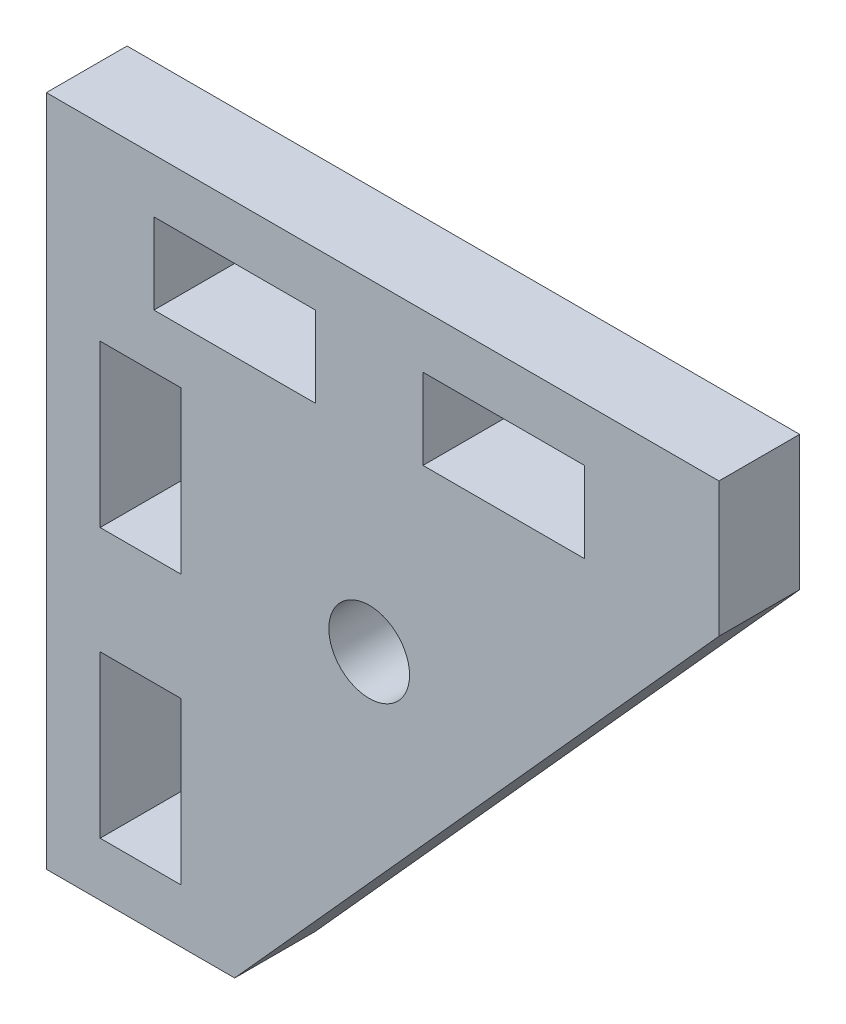
ISO-10303-21;
HEADER;
FILE_DESCRIPTION(('STEP AP214'),'2;1');
FILE_NAME('part.step','',(''),(''),'','','');
FILE_SCHEMA(('AUTOMOTIVE_DESIGN { 1 0 10303 214 1 1 1 1 }'));
ENDSEC;
DATA;
#1=APPLICATION_CONTEXT('core data for automotive mechanical design processes');
#2=APPLICATION_PROTOCOL_DEFINITION('international standard','automotive_design',2000,#1);
#3=PRODUCT_CONTEXT('',#1,'mechanical');
#4=PRODUCT('Part','Part','',(#3));
#5=PRODUCT_RELATED_PRODUCT_CATEGORY('part','',(#4));
#6=PRODUCT_DEFINITION_FORMATION('','',#4);
#7=PRODUCT_DEFINITION_CONTEXT('part definition',#1,'design');
#8=PRODUCT_DEFINITION('design','',#6,#7);
#9=PRODUCT_DEFINITION_SHAPE('','',#8);
#10=(LENGTH_UNIT() NAMED_UNIT(*) SI_UNIT(.MILLI.,.METRE.));
#11=(NAMED_UNIT(*) PLANE_ANGLE_UNIT() SI_UNIT($,.RADIAN.));
#12=(NAMED_UNIT(*) SI_UNIT($,.STERADIAN.) SOLID_ANGLE_UNIT());
#13=UNCERTAINTY_MEASURE_WITH_UNIT(LENGTH_MEASURE(1.E-05),#10,'distance_accuracy_value','');
#14=(GEOMETRIC_REPRESENTATION_CONTEXT(3) GLOBAL_UNCERTAINTY_ASSIGNED_CONTEXT((#13)) GLOBAL_UNIT_ASSIGNED_CONTEXT((#10,
#11,#12)) REPRESENTATION_CONTEXT('',''));
#15=CARTESIAN_POINT('',(0.,0.,0.));
#16=DIRECTION('',(0.,0.,1.));
#17=DIRECTION('',(1.,0.,0.));
#18=AXIS2_PLACEMENT_3D('',#15,#16,#17);
#19=CARTESIAN_POINT('',(0.,0.,3.));
#20=DIRECTION('',(0.,0.,-1.));
#21=DIRECTION('',(-1.,0.,0.));
#22=AXIS2_PLACEMENT_3D('',#19,#20,#21);
#23=PLANE('',#22);
#24=CARTESIAN_POINT('',(12.,-12.,3.));
#25=DIRECTION('',(0.,0.,1.));
#26=DIRECTION('',(1.,0.,0.));
#27=AXIS2_PLACEMENT_3D('',#24,#25,#26);
#28=CIRCLE('',#27,1.5);
#29=CARTESIAN_POINT('',(13.5,-12.,3.));
#30=VERTEX_POINT('',#29);
#31=EDGE_CURVE('E667',#30,#30,#28,.T.);
#32=ORIENTED_EDGE('',*,*,#31,.F.);
#33=EDGE_LOOP('',(#32));
#34=FACE_BOUND('',#33,.T.);
#35=DIRECTION('',(0.,-1.,0.));
#36=VECTOR('',#35,1.);
#37=CARTESIAN_POINT('',(2.,-17.,3.));
#38=LINE('',#37,#36);
#39=CARTESIAN_POINT('',(2.,-17.,3.));
#40=VERTEX_POINT('',#39);
#41=CARTESIAN_POINT('',(2.,-23.,3.));
#42=VERTEX_POINT('',#41);
#43=EDGE_CURVE('E233',#40,#42,#38,.T.);
#44=ORIENTED_EDGE('',*,*,#43,.F.);
#45=DIRECTION('',(-1.,0.,0.));
#46=VECTOR('',#45,1.);
#47=CARTESIAN_POINT('',(2.,-17.,3.));
#48=LINE('',#47,#46);
#49=CARTESIAN_POINT('',(5.,-17.,3.));
#50=VERTEX_POINT('',#49);
#51=EDGE_CURVE('E244',#50,#40,#48,.T.);
#52=ORIENTED_EDGE('',*,*,#51,.F.);
#53=DIRECTION('',(0.,1.,0.));
#54=VECTOR('',#53,1.);
#55=CARTESIAN_POINT('',(5.,-17.,3.));
#56=LINE('',#55,#54);
#57=CARTESIAN_POINT('',(5.,-23.,3.));
#58=VERTEX_POINT('',#57);
#59=EDGE_CURVE('E240',#58,#50,#56,.T.);
#60=ORIENTED_EDGE('',*,*,#59,.F.);
#61=DIRECTION('',(1.,0.,0.));
#62=VECTOR('',#61,1.);
#63=CARTESIAN_POINT('',(2.,-23.,3.));
#64=LINE('',#63,#62);
#65=EDGE_CURVE('E236',#42,#58,#64,.T.);
#66=ORIENTED_EDGE('',*,*,#65,.F.);
#67=EDGE_LOOP('',(#44,#52,#60,#66));
#68=FACE_BOUND('',#67,.T.);
#69=DIRECTION('',(0.,-1.,0.));
#70=VECTOR('',#69,1.);
#71=CARTESIAN_POINT('',(2.,-7.,3.));
#72=LINE('',#71,#70);
#73=CARTESIAN_POINT('',(2.,-7.,3.));
#74=VERTEX_POINT('',#73);
#75=CARTESIAN_POINT('',(2.,-13.,3.));
#76=VERTEX_POINT('',#75);
#77=EDGE_CURVE('E319',#74,#76,#72,.T.);
#78=ORIENTED_EDGE('',*,*,#77,.F.);
#79=DIRECTION('',(-1.,0.,0.));
#80=VECTOR('',#79,1.);
#81=CARTESIAN_POINT('',(2.,-7.,3.));
#82=LINE('',#81,#80);
#83=CARTESIAN_POINT('',(5.,-7.,3.));
#84=VERTEX_POINT('',#83);
#85=EDGE_CURVE('E330',#84,#74,#82,.T.);
#86=ORIENTED_EDGE('',*,*,#85,.F.);
#87=DIRECTION('',(0.,1.,0.));
#88=VECTOR('',#87,1.);
#89=CARTESIAN_POINT('',(5.,-7.,3.));
#90=LINE('',#89,#88);
#91=CARTESIAN_POINT('',(5.,-13.,3.));
#92=VERTEX_POINT('',#91);
#93=EDGE_CURVE('E326',#92,#84,#90,.T.);
#94=ORIENTED_EDGE('',*,*,#93,.F.);
#95=DIRECTION('',(1.,0.,0.));
#96=VECTOR('',#95,1.);
#97=CARTESIAN_POINT('',(2.,-13.,3.));
#98=LINE('',#97,#96);
#99=EDGE_CURVE('E322',#76,#92,#98,.T.);
#100=ORIENTED_EDGE('',*,*,#99,.F.);
#101=EDGE_LOOP('',(#78,#86,#94,#100));
#102=FACE_BOUND('',#101,.T.);
#103=DIRECTION('',(-1.,0.,0.));
#104=VECTOR('',#103,1.);
#105=CARTESIAN_POINT('',(0.,0.,3.));
#106=LINE('',#105,#104);
#107=CARTESIAN_POINT('',(25.,0.,3.));
#108=VERTEX_POINT('',#107);
#109=CARTESIAN_POINT('',(0.,0.,3.));
#110=VERTEX_POINT('',#109);
#111=EDGE_CURVE('E362',#108,#110,#106,.T.);
#112=ORIENTED_EDGE('',*,*,#111,.T.);
#113=DIRECTION('',(0.,-1.,0.));
#114=VECTOR('',#113,1.);
#115=CARTESIAN_POINT('',(0.,0.,3.));
#116=LINE('',#115,#114);
#117=CARTESIAN_POINT('',(0.,-25.,3.));
#118=VERTEX_POINT('',#117);
#119=EDGE_CURVE('E366',#110,#118,#116,.T.);
#120=ORIENTED_EDGE('',*,*,#119,.T.);
#121=DIRECTION('',(1.,0.,0.));
#122=VECTOR('',#121,1.);
#123=CARTESIAN_POINT('',(0.,-25.,3.));
#124=LINE('',#123,#122);
#125=CARTESIAN_POINT('',(7.,-25.,3.));
#126=VERTEX_POINT('',#125);
#127=EDGE_CURVE('E370',#118,#126,#124,.T.);
#128=ORIENTED_EDGE('',*,*,#127,.T.);
#129=DIRECTION('',(0.66896473162245,0.743294146247166,0.));
#130=VECTOR('',#129,1.);
#131=CARTESIAN_POINT('',(25.,-5.,3.));
#132=LINE('',#131,#130);
#133=CARTESIAN_POINT('',(25.,-5.,3.));
#134=VERTEX_POINT('',#133);
#135=EDGE_CURVE('E373',#126,#134,#132,.T.);
#136=ORIENTED_EDGE('',*,*,#135,.T.);
#137=DIRECTION('',(0.,1.,0.));
#138=VECTOR('',#137,1.);
#139=CARTESIAN_POINT('',(25.,0.,3.));
#140=LINE('',#139,#138);
#141=EDGE_CURVE('E376',#134,#108,#140,.T.);
#142=ORIENTED_EDGE('',*,*,#141,.T.);
#143=EDGE_LOOP('',(#112,#120,#128,#136,#142));
#144=FACE_BOUND('',#143,.T.);
#145=DIRECTION('',(0.,-1.,0.));
#146=VECTOR('',#145,1.);
#147=CARTESIAN_POINT('',(4.,-2.,3.));
#148=LINE('',#147,#146);
#149=CARTESIAN_POINT('',(4.,-2.,3.));
#150=VERTEX_POINT('',#149);
#151=CARTESIAN_POINT('',(4.,-5.,3.));
#152=VERTEX_POINT('',#151);
#153=EDGE_CURVE('E276',#150,#152,#148,.T.);
#154=ORIENTED_EDGE('',*,*,#153,.F.);
#155=DIRECTION('',(-1.,0.,0.));
#156=VECTOR('',#155,1.);
#157=CARTESIAN_POINT('',(4.,-2.,3.));
#158=LINE('',#157,#156);
#159=CARTESIAN_POINT('',(10.,-2.,3.));
#160=VERTEX_POINT('',#159);
#161=EDGE_CURVE('E287',#160,#150,#158,.T.);
#162=ORIENTED_EDGE('',*,*,#161,.F.);
#163=DIRECTION('',(0.,1.,0.));
#164=VECTOR('',#163,1.);
#165=CARTESIAN_POINT('',(10.,-2.,3.));
#166=LINE('',#165,#164);
#167=CARTESIAN_POINT('',(10.,-5.,3.));
#168=VERTEX_POINT('',#167);
#169=EDGE_CURVE('E283',#168,#160,#166,.T.);
#170=ORIENTED_EDGE('',*,*,#169,.F.);
#171=DIRECTION('',(1.,0.,0.));
#172=VECTOR('',#171,1.);
#173=CARTESIAN_POINT('',(4.,-5.,3.));
#174=LINE('',#173,#172);
#175=EDGE_CURVE('E279',#152,#168,#174,.T.);
#176=ORIENTED_EDGE('',*,*,#175,.F.);
#177=EDGE_LOOP('',(#154,#162,#170,#176));
#178=FACE_BOUND('',#177,.T.);
#179=DIRECTION('',(-1.,0.,0.));
#180=VECTOR('',#179,1.);
#181=CARTESIAN_POINT('',(14.,-2.,3.));
#182=LINE('',#181,#180);
#183=CARTESIAN_POINT('',(20.,-2.,3.));
#184=VERTEX_POINT('',#183);
#185=CARTESIAN_POINT('',(14.,-2.,3.));
#186=VERTEX_POINT('',#185);
#187=EDGE_CURVE('E184',#184,#186,#182,.T.);
#188=ORIENTED_EDGE('',*,*,#187,.F.);
#189=DIRECTION('',(0.,1.,0.));
#190=VECTOR('',#189,1.);
#191=CARTESIAN_POINT('',(20.,-2.,3.));
#192=LINE('',#191,#190);
#193=CARTESIAN_POINT('',(20.,-5.,3.));
#194=VERTEX_POINT('',#193);
#195=EDGE_CURVE('E210',#194,#184,#192,.T.);
#196=ORIENTED_EDGE('',*,*,#195,.F.);
#197=DIRECTION('',(1.,0.,0.));
#198=VECTOR('',#197,1.);
#199=CARTESIAN_POINT('',(14.,-5.,3.));
#200=LINE('',#199,#198);
#201=CARTESIAN_POINT('',(14.,-5.,3.));
#202=VERTEX_POINT('',#201);
#203=EDGE_CURVE('E206',#202,#194,#200,.T.);
#204=ORIENTED_EDGE('',*,*,#203,.F.);
#205=DIRECTION('',(0.,-1.,0.));
#206=VECTOR('',#205,1.);
#207=CARTESIAN_POINT('',(14.,-2.,3.));
#208=LINE('',#207,#206);
#209=EDGE_CURVE('E193',#186,#202,#208,.T.);
#210=ORIENTED_EDGE('',*,*,#209,.F.);
#211=EDGE_LOOP('',(#188,#196,#204,#210));
#212=FACE_BOUND('',#211,.T.);
#213=ADVANCED_FACE('F39',(#34,#68,#102,#144,#178,#212),#23,.F.);
#214=CARTESIAN_POINT('',(0.,0.,0.));
#215=DIRECTION('',(0.,0.,-1.));
#216=DIRECTION('',(-1.,0.,0.));
#217=AXIS2_PLACEMENT_3D('',#214,#215,#216);
#218=PLANE('',#217);
#219=CARTESIAN_POINT('',(12.,-12.,0.));
#220=DIRECTION('',(0.,0.,-1.));
#221=DIRECTION('',(-1.,0.,0.));
#222=AXIS2_PLACEMENT_3D('',#219,#220,#221);
#223=CIRCLE('',#222,1.5);
#224=CARTESIAN_POINT('',(10.5,-12.,0.));
#225=VERTEX_POINT('',#224);
#226=EDGE_CURVE('E43',#225,#225,#223,.T.);
#227=ORIENTED_EDGE('',*,*,#226,.F.);
#228=EDGE_LOOP('',(#227));
#229=FACE_BOUND('',#228,.T.);
#230=DIRECTION('',(-1.,0.,0.));
#231=VECTOR('',#230,1.);
#232=CARTESIAN_POINT('',(0.,0.,0.));
#233=LINE('',#232,#231);
#234=CARTESIAN_POINT('',(25.,0.,0.));
#235=VERTEX_POINT('',#234);
#236=CARTESIAN_POINT('',(0.,0.,0.));
#237=VERTEX_POINT('',#236);
#238=EDGE_CURVE('E361',#235,#237,#233,.T.);
#239=ORIENTED_EDGE('',*,*,#238,.F.);
#240=DIRECTION('',(0.,1.,0.));
#241=VECTOR('',#240,1.);
#242=CARTESIAN_POINT('',(25.,0.,0.));
#243=LINE('',#242,#241);
#244=CARTESIAN_POINT('',(25.,-5.,0.));
#245=VERTEX_POINT('',#244);
#246=EDGE_CURVE('E367',#245,#235,#243,.T.);
#247=ORIENTED_EDGE('',*,*,#246,.F.);
#248=DIRECTION('',(0.66896473162245,0.743294146247166,0.));
#249=VECTOR('',#248,1.);
#250=CARTESIAN_POINT('',(25.,-5.,0.));
#251=LINE('',#250,#249);
#252=CARTESIAN_POINT('',(7.,-25.,0.));
#253=VERTEX_POINT('',#252);
#254=EDGE_CURVE('E389',#253,#245,#251,.T.);
#255=ORIENTED_EDGE('',*,*,#254,.F.);
#256=DIRECTION('',(1.,0.,0.));
#257=VECTOR('',#256,1.);
#258=CARTESIAN_POINT('',(0.,-25.,0.));
#259=LINE('',#258,#257);
#260=CARTESIAN_POINT('',(0.,-25.,0.));
#261=VERTEX_POINT('',#260);
#262=EDGE_CURVE('E386',#261,#253,#259,.T.);
#263=ORIENTED_EDGE('',*,*,#262,.F.);
#264=DIRECTION('',(0.,-1.,0.));
#265=VECTOR('',#264,1.);
#266=CARTESIAN_POINT('',(0.,-5.,0.));
#267=LINE('',#266,#265);
#268=EDGE_CURVE('E383',#237,#261,#267,.T.);
#269=ORIENTED_EDGE('',*,*,#268,.F.);
#270=EDGE_LOOP('',(#239,#247,#255,#263,#269));
#271=FACE_BOUND('',#270,.T.);
#272=DIRECTION('',(-1.,0.,0.));
#273=VECTOR('',#272,1.);
#274=CARTESIAN_POINT('',(2.,-7.,0.));
#275=LINE('',#274,#273);
#276=CARTESIAN_POINT('',(5.,-7.,0.));
#277=VERTEX_POINT('',#276);
#278=CARTESIAN_POINT('',(2.,-7.,0.));
#279=VERTEX_POINT('',#278);
#280=EDGE_CURVE('E323',#277,#279,#275,.T.);
#281=ORIENTED_EDGE('',*,*,#280,.T.);
#282=DIRECTION('',(0.,-1.,0.));
#283=VECTOR('',#282,1.);
#284=CARTESIAN_POINT('',(2.,-7.,0.));
#285=LINE('',#284,#283);
#286=CARTESIAN_POINT('',(2.,-13.,0.));
#287=VERTEX_POINT('',#286);
#288=EDGE_CURVE('E318',#279,#287,#285,.T.);
#289=ORIENTED_EDGE('',*,*,#288,.T.);
#290=DIRECTION('',(1.,0.,0.));
#291=VECTOR('',#290,1.);
#292=CARTESIAN_POINT('',(2.,-13.,0.));
#293=LINE('',#292,#291);
#294=CARTESIAN_POINT('',(5.,-13.,0.));
#295=VERTEX_POINT('',#294);
#296=EDGE_CURVE('E337',#287,#295,#293,.T.);
#297=ORIENTED_EDGE('',*,*,#296,.T.);
#298=DIRECTION('',(0.,1.,0.));
#299=VECTOR('',#298,1.);
#300=CARTESIAN_POINT('',(5.,-7.,0.));
#301=LINE('',#300,#299);
#302=EDGE_CURVE('E341',#295,#277,#301,.T.);
#303=ORIENTED_EDGE('',*,*,#302,.T.);
#304=EDGE_LOOP('',(#281,#289,#297,#303));
#305=FACE_BOUND('',#304,.T.);
#306=DIRECTION('',(-1.,0.,0.));
#307=VECTOR('',#306,1.);
#308=CARTESIAN_POINT('',(4.,-2.,0.));
#309=LINE('',#308,#307);
#310=CARTESIAN_POINT('',(10.,-2.,0.));
#311=VERTEX_POINT('',#310);
#312=CARTESIAN_POINT('',(4.,-2.,0.));
#313=VERTEX_POINT('',#312);
#314=EDGE_CURVE('E280',#311,#313,#309,.T.);
#315=ORIENTED_EDGE('',*,*,#314,.T.);
#316=DIRECTION('',(0.,-1.,0.));
#317=VECTOR('',#316,1.);
#318=CARTESIAN_POINT('',(4.,-2.,0.));
#319=LINE('',#318,#317);
#320=CARTESIAN_POINT('',(4.,-5.,0.));
#321=VERTEX_POINT('',#320);
#322=EDGE_CURVE('E275',#313,#321,#319,.T.);
#323=ORIENTED_EDGE('',*,*,#322,.T.);
#324=DIRECTION('',(1.,0.,0.));
#325=VECTOR('',#324,1.);
#326=CARTESIAN_POINT('',(4.,-5.,0.));
#327=LINE('',#326,#325);
#328=CARTESIAN_POINT('',(10.,-5.,0.));
#329=VERTEX_POINT('',#328);
#330=EDGE_CURVE('E294',#321,#329,#327,.T.);
#331=ORIENTED_EDGE('',*,*,#330,.T.);
#332=DIRECTION('',(0.,1.,0.));
#333=VECTOR('',#332,1.);
#334=CARTESIAN_POINT('',(10.,-2.,0.));
#335=LINE('',#334,#333);
#336=EDGE_CURVE('E298',#329,#311,#335,.T.);
#337=ORIENTED_EDGE('',*,*,#336,.T.);
#338=EDGE_LOOP('',(#315,#323,#331,#337));
#339=FACE_BOUND('',#338,.T.);
#340=DIRECTION('',(-1.,0.,0.));
#341=VECTOR('',#340,1.);
#342=CARTESIAN_POINT('',(2.,-17.,0.));
#343=LINE('',#342,#341);
#344=CARTESIAN_POINT('',(5.,-17.,0.));
#345=VERTEX_POINT('',#344);
#346=CARTESIAN_POINT('',(2.,-17.,0.));
#347=VERTEX_POINT('',#346);
#348=EDGE_CURVE('E237',#345,#347,#343,.T.);
#349=ORIENTED_EDGE('',*,*,#348,.T.);
#350=DIRECTION('',(0.,-1.,0.));
#351=VECTOR('',#350,1.);
#352=CARTESIAN_POINT('',(2.,-17.,0.));
#353=LINE('',#352,#351);
#354=CARTESIAN_POINT('',(2.,-23.,0.));
#355=VERTEX_POINT('',#354);
#356=EDGE_CURVE('E202',#347,#355,#353,.T.);
#357=ORIENTED_EDGE('',*,*,#356,.T.);
#358=DIRECTION('',(1.,0.,0.));
#359=VECTOR('',#358,1.);
#360=CARTESIAN_POINT('',(2.,-23.,0.));
#361=LINE('',#360,#359);
#362=CARTESIAN_POINT('',(5.,-23.,0.));
#363=VERTEX_POINT('',#362);
#364=EDGE_CURVE('E251',#355,#363,#361,.T.);
#365=ORIENTED_EDGE('',*,*,#364,.T.);
#366=DIRECTION('',(0.,1.,0.));
#367=VECTOR('',#366,1.);
#368=CARTESIAN_POINT('',(5.,-17.,0.));
#369=LINE('',#368,#367);
#370=EDGE_CURVE('E255',#363,#345,#369,.T.);
#371=ORIENTED_EDGE('',*,*,#370,.T.);
#372=EDGE_LOOP('',(#349,#357,#365,#371));
#373=FACE_BOUND('',#372,.T.);
#374=DIRECTION('',(0.,1.,0.));
#375=VECTOR('',#374,1.);
#376=CARTESIAN_POINT('',(20.,-2.,0.));
#377=LINE('',#376,#375);
#378=CARTESIAN_POINT('',(20.,-5.,0.));
#379=VERTEX_POINT('',#378);
#380=CARTESIAN_POINT('',(20.,-2.,0.));
#381=VERTEX_POINT('',#380);
#382=EDGE_CURVE('E194',#379,#381,#377,.T.);
#383=ORIENTED_EDGE('',*,*,#382,.T.);
#384=DIRECTION('',(-1.,0.,0.));
#385=VECTOR('',#384,1.);
#386=CARTESIAN_POINT('',(14.,-2.,0.));
#387=LINE('',#386,#385);
#388=CARTESIAN_POINT('',(14.,-2.,0.));
#389=VERTEX_POINT('',#388);
#390=EDGE_CURVE('E64',#381,#389,#387,.T.);
#391=ORIENTED_EDGE('',*,*,#390,.T.);
#392=DIRECTION('',(0.,-1.,0.));
#393=VECTOR('',#392,1.);
#394=CARTESIAN_POINT('',(14.,-2.,0.));
#395=LINE('',#394,#393);
#396=CARTESIAN_POINT('',(14.,-5.,0.));
#397=VERTEX_POINT('',#396);
#398=EDGE_CURVE('E200',#389,#397,#395,.T.);
#399=ORIENTED_EDGE('',*,*,#398,.T.);
#400=DIRECTION('',(1.,0.,0.));
#401=VECTOR('',#400,1.);
#402=CARTESIAN_POINT('',(14.,-5.,0.));
#403=LINE('',#402,#401);
#404=EDGE_CURVE('E220',#397,#379,#403,.T.);
#405=ORIENTED_EDGE('',*,*,#404,.T.);
#406=EDGE_LOOP('',(#383,#391,#399,#405));
#407=FACE_BOUND('',#406,.T.);
#408=ADVANCED_FACE('F417',(#229,#271,#305,#339,#373,#407),#218,.T.);
#409=CARTESIAN_POINT('',(0.,0.,3.));
#410=DIRECTION('',(0.,-1.,0.));
#411=DIRECTION('',(0.,0.,-1.));
#412=AXIS2_PLACEMENT_3D('',#409,#410,#411);
#413=PLANE('',#412);
#414=ORIENTED_EDGE('',*,*,#238,.T.);
#415=DIRECTION('',(0.,0.,-1.));
#416=VECTOR('',#415,1.);
#417=CARTESIAN_POINT('',(0.,0.,3.));
#418=LINE('',#417,#416);
#419=EDGE_CURVE('E11',#110,#237,#418,.T.);
#420=ORIENTED_EDGE('',*,*,#419,.F.);
#421=ORIENTED_EDGE('',*,*,#111,.F.);
#422=DIRECTION('',(0.,0.,-1.));
#423=VECTOR('',#422,1.);
#424=CARTESIAN_POINT('',(25.,0.,3.));
#425=LINE('',#424,#423);
#426=EDGE_CURVE('E379',#108,#235,#425,.T.);
#427=ORIENTED_EDGE('',*,*,#426,.T.);
#428=EDGE_LOOP('',(#414,#420,#421,#427));
#429=FACE_BOUND('',#428,.T.);
#430=ADVANCED_FACE('F41',(#429),#413,.F.);
#431=CARTESIAN_POINT('',(0.,-5.,3.));
#432=DIRECTION('',(1.,0.,0.));
#433=DIRECTION('',(0.,1.,0.));
#434=AXIS2_PLACEMENT_3D('',#431,#432,#433);
#435=PLANE('',#434);
#436=ORIENTED_EDGE('',*,*,#268,.T.);
#437=DIRECTION('',(0.,0.,-1.));
#438=VECTOR('',#437,1.);
#439=CARTESIAN_POINT('',(0.,-25.,3.));
#440=LINE('',#439,#438);
#441=EDGE_CURVE('E49',#118,#261,#440,.T.);
#442=ORIENTED_EDGE('',*,*,#441,.F.);
#443=ORIENTED_EDGE('',*,*,#119,.F.);
#444=ORIENTED_EDGE('',*,*,#419,.T.);
#445=EDGE_LOOP('',(#436,#442,#443,#444));
#446=FACE_BOUND('',#445,.T.);
#447=ADVANCED_FACE('F432',(#446),#435,.F.);
#448=CARTESIAN_POINT('',(0.,-25.,3.));
#449=DIRECTION('',(0.,1.,0.));
#450=DIRECTION('',(0.,0.,1.));
#451=AXIS2_PLACEMENT_3D('',#448,#449,#450);
#452=PLANE('',#451);
#453=ORIENTED_EDGE('',*,*,#262,.T.);
#454=DIRECTION('',(0.,0.,-1.));
#455=VECTOR('',#454,1.);
#456=CARTESIAN_POINT('',(7.,-25.,3.));
#457=LINE('',#456,#455);
#458=EDGE_CURVE('E401',#126,#253,#457,.T.);
#459=ORIENTED_EDGE('',*,*,#458,.F.);
#460=ORIENTED_EDGE('',*,*,#127,.F.);
#461=ORIENTED_EDGE('',*,*,#441,.T.);
#462=EDGE_LOOP('',(#453,#459,#460,#461));
#463=FACE_BOUND('',#462,.T.);
#464=ADVANCED_FACE('F411',(#463),#452,.F.);
#465=CARTESIAN_POINT('',(25.,-5.,3.));
#466=DIRECTION('',(-0.743294146247166,0.66896473162245,0.));
#467=DIRECTION('',(-0.66896473162245,-0.743294146247166,0.));
#468=AXIS2_PLACEMENT_3D('',#465,#466,#467);
#469=PLANE('',#468);
#470=ORIENTED_EDGE('',*,*,#254,.T.);
#471=DIRECTION('',(0.,0.,-1.));
#472=VECTOR('',#471,1.);
#473=CARTESIAN_POINT('',(25.,-5.,3.));
#474=LINE('',#473,#472);
#475=EDGE_CURVE('E397',#134,#245,#474,.T.);
#476=ORIENTED_EDGE('',*,*,#475,.F.);
#477=ORIENTED_EDGE('',*,*,#135,.F.);
#478=ORIENTED_EDGE('',*,*,#458,.T.);
#479=EDGE_LOOP('',(#470,#476,#477,#478));
#480=FACE_BOUND('',#479,.T.);
#481=ADVANCED_FACE('F422',(#480),#469,.F.);
#482=CARTESIAN_POINT('',(25.,0.,3.));
#483=DIRECTION('',(-1.,0.,0.));
#484=DIRECTION('',(0.,0.,1.));
#485=AXIS2_PLACEMENT_3D('',#482,#483,#484);
#486=PLANE('',#485);
#487=ORIENTED_EDGE('',*,*,#246,.T.);
#488=ORIENTED_EDGE('',*,*,#426,.F.);
#489=ORIENTED_EDGE('',*,*,#141,.F.);
#490=ORIENTED_EDGE('',*,*,#475,.T.);
#491=EDGE_LOOP('',(#487,#488,#489,#490));
#492=FACE_BOUND('',#491,.T.);
#493=ADVANCED_FACE('F426',(#492),#486,.F.);
#494=CARTESIAN_POINT('',(2.,-7.,3.));
#495=DIRECTION('',(1.,0.,0.));
#496=DIRECTION('',(0.,1.,0.));
#497=AXIS2_PLACEMENT_3D('',#494,#495,#496);
#498=PLANE('',#497);
#499=ORIENTED_EDGE('',*,*,#288,.F.);
#500=DIRECTION('',(0.,0.,-1.));
#501=VECTOR('',#500,1.);
#502=CARTESIAN_POINT('',(2.,-7.,3.));
#503=LINE('',#502,#501);
#504=EDGE_CURVE('E333',#74,#279,#503,.T.);
#505=ORIENTED_EDGE('',*,*,#504,.F.);
#506=ORIENTED_EDGE('',*,*,#77,.T.);
#507=DIRECTION('',(0.,0.,-1.));
#508=VECTOR('',#507,1.);
#509=CARTESIAN_POINT('',(2.,-13.,3.));
#510=LINE('',#509,#508);
#511=EDGE_CURVE('E357',#76,#287,#510,.T.);
#512=ORIENTED_EDGE('',*,*,#511,.T.);
#513=EDGE_LOOP('',(#499,#505,#506,#512));
#514=FACE_BOUND('',#513,.T.);
#515=ADVANCED_FACE('F449',(#514),#498,.T.);
#516=CARTESIAN_POINT('',(2.,-13.,3.));
#517=DIRECTION('',(0.,1.,0.));
#518=DIRECTION('',(0.,0.,1.));
#519=AXIS2_PLACEMENT_3D('',#516,#517,#518);
#520=PLANE('',#519);
#521=ORIENTED_EDGE('',*,*,#296,.F.);
#522=ORIENTED_EDGE('',*,*,#511,.F.);
#523=ORIENTED_EDGE('',*,*,#99,.T.);
#524=DIRECTION('',(0.,0.,-1.));
#525=VECTOR('',#524,1.);
#526=CARTESIAN_POINT('',(5.,-13.,3.));
#527=LINE('',#526,#525);
#528=EDGE_CURVE('E354',#92,#295,#527,.T.);
#529=ORIENTED_EDGE('',*,*,#528,.T.);
#530=EDGE_LOOP('',(#521,#522,#523,#529));
#531=FACE_BOUND('',#530,.T.);
#532=ADVANCED_FACE('F475',(#531),#520,.T.);
#533=CARTESIAN_POINT('',(5.,-7.,3.));
#534=DIRECTION('',(-1.,0.,0.));
#535=DIRECTION('',(0.,0.,1.));
#536=AXIS2_PLACEMENT_3D('',#533,#534,#535);
#537=PLANE('',#536);
#538=ORIENTED_EDGE('',*,*,#302,.F.);
#539=ORIENTED_EDGE('',*,*,#528,.F.);
#540=ORIENTED_EDGE('',*,*,#93,.T.);
#541=DIRECTION('',(0.,0.,-1.));
#542=VECTOR('',#541,1.);
#543=CARTESIAN_POINT('',(5.,-7.,3.));
#544=LINE('',#543,#542);
#545=EDGE_CURVE('E351',#84,#277,#544,.T.);
#546=ORIENTED_EDGE('',*,*,#545,.T.);
#547=EDGE_LOOP('',(#538,#539,#540,#546));
#548=FACE_BOUND('',#547,.T.);
#549=ADVANCED_FACE('F482',(#548),#537,.T.);
#550=CARTESIAN_POINT('',(2.,-7.,3.));
#551=DIRECTION('',(0.,-1.,0.));
#552=DIRECTION('',(0.,0.,-1.));
#553=AXIS2_PLACEMENT_3D('',#550,#551,#552);
#554=PLANE('',#553);
#555=ORIENTED_EDGE('',*,*,#280,.F.);
#556=ORIENTED_EDGE('',*,*,#545,.F.);
#557=ORIENTED_EDGE('',*,*,#85,.T.);
#558=ORIENTED_EDGE('',*,*,#504,.T.);
#559=EDGE_LOOP('',(#555,#556,#557,#558));
#560=FACE_BOUND('',#559,.T.);
#561=ADVANCED_FACE('F489',(#560),#554,.T.);
#562=CARTESIAN_POINT('',(4.,-2.,3.));
#563=DIRECTION('',(1.,0.,0.));
#564=DIRECTION('',(0.,1.,0.));
#565=AXIS2_PLACEMENT_3D('',#562,#563,#564);
#566=PLANE('',#565);
#567=ORIENTED_EDGE('',*,*,#322,.F.);
#568=DIRECTION('',(0.,0.,-1.));
#569=VECTOR('',#568,1.);
#570=CARTESIAN_POINT('',(4.,-2.,3.));
#571=LINE('',#570,#569);
#572=EDGE_CURVE('E290',#150,#313,#571,.T.);
#573=ORIENTED_EDGE('',*,*,#572,.F.);
#574=ORIENTED_EDGE('',*,*,#153,.T.);
#575=DIRECTION('',(0.,0.,-1.));
#576=VECTOR('',#575,1.);
#577=CARTESIAN_POINT('',(4.,-5.,3.));
#578=LINE('',#577,#576);
#579=EDGE_CURVE('E314',#152,#321,#578,.T.);
#580=ORIENTED_EDGE('',*,*,#579,.T.);
#581=EDGE_LOOP('',(#567,#573,#574,#580));
#582=FACE_BOUND('',#581,.T.);
#583=ADVANCED_FACE('F497',(#582),#566,.T.);
#584=CARTESIAN_POINT('',(4.,-5.,3.));
#585=DIRECTION('',(0.,1.,0.));
#586=DIRECTION('',(0.,0.,1.));
#587=AXIS2_PLACEMENT_3D('',#584,#585,#586);
#588=PLANE('',#587);
#589=ORIENTED_EDGE('',*,*,#330,.F.);
#590=ORIENTED_EDGE('',*,*,#579,.F.);
#591=ORIENTED_EDGE('',*,*,#175,.T.);
#592=DIRECTION('',(0.,0.,-1.));
#593=VECTOR('',#592,1.);
#594=CARTESIAN_POINT('',(10.,-5.,3.));
#595=LINE('',#594,#593);
#596=EDGE_CURVE('E311',#168,#329,#595,.T.);
#597=ORIENTED_EDGE('',*,*,#596,.T.);
#598=EDGE_LOOP('',(#589,#590,#591,#597));
#599=FACE_BOUND('',#598,.T.);
#600=ADVANCED_FACE('F505',(#599),#588,.T.);
#601=CARTESIAN_POINT('',(10.,-2.,3.));
#602=DIRECTION('',(-1.,0.,0.));
#603=DIRECTION('',(0.,0.,1.));
#604=AXIS2_PLACEMENT_3D('',#601,#602,#603);
#605=PLANE('',#604);
#606=ORIENTED_EDGE('',*,*,#336,.F.);
#607=ORIENTED_EDGE('',*,*,#596,.F.);
#608=ORIENTED_EDGE('',*,*,#169,.T.);
#609=DIRECTION('',(0.,0.,-1.));
#610=VECTOR('',#609,1.);
#611=CARTESIAN_POINT('',(10.,-2.,3.));
#612=LINE('',#611,#610);
#613=EDGE_CURVE('E308',#160,#311,#612,.T.);
#614=ORIENTED_EDGE('',*,*,#613,.T.);
#615=EDGE_LOOP('',(#606,#607,#608,#614));
#616=FACE_BOUND('',#615,.T.);
#617=ADVANCED_FACE('F513',(#616),#605,.T.);
#618=CARTESIAN_POINT('',(4.,-2.,3.));
#619=DIRECTION('',(0.,-1.,0.));
#620=DIRECTION('',(0.,0.,-1.));
#621=AXIS2_PLACEMENT_3D('',#618,#619,#620);
#622=PLANE('',#621);
#623=ORIENTED_EDGE('',*,*,#314,.F.);
#624=ORIENTED_EDGE('',*,*,#613,.F.);
#625=ORIENTED_EDGE('',*,*,#161,.T.);
#626=ORIENTED_EDGE('',*,*,#572,.T.);
#627=EDGE_LOOP('',(#623,#624,#625,#626));
#628=FACE_BOUND('',#627,.T.);
#629=ADVANCED_FACE('F521',(#628),#622,.T.);
#630=CARTESIAN_POINT('',(2.,-17.,3.));
#631=DIRECTION('',(1.,0.,0.));
#632=DIRECTION('',(0.,1.,0.));
#633=AXIS2_PLACEMENT_3D('',#630,#631,#632);
#634=PLANE('',#633);
#635=ORIENTED_EDGE('',*,*,#356,.F.);
#636=DIRECTION('',(0.,0.,-1.));
#637=VECTOR('',#636,1.);
#638=CARTESIAN_POINT('',(2.,-17.,3.));
#639=LINE('',#638,#637);
#640=EDGE_CURVE('E247',#40,#347,#639,.T.);
#641=ORIENTED_EDGE('',*,*,#640,.F.);
#642=ORIENTED_EDGE('',*,*,#43,.T.);
#643=DIRECTION('',(0.,0.,-1.));
#644=VECTOR('',#643,1.);
#645=CARTESIAN_POINT('',(2.,-23.,3.));
#646=LINE('',#645,#644);
#647=EDGE_CURVE('E271',#42,#355,#646,.T.);
#648=ORIENTED_EDGE('',*,*,#647,.T.);
#649=EDGE_LOOP('',(#635,#641,#642,#648));
#650=FACE_BOUND('',#649,.T.);
#651=ADVANCED_FACE('F529',(#650),#634,.T.);
#652=CARTESIAN_POINT('',(2.,-23.,3.));
#653=DIRECTION('',(0.,1.,0.));
#654=DIRECTION('',(0.,0.,1.));
#655=AXIS2_PLACEMENT_3D('',#652,#653,#654);
#656=PLANE('',#655);
#657=ORIENTED_EDGE('',*,*,#364,.F.);
#658=ORIENTED_EDGE('',*,*,#647,.F.);
#659=ORIENTED_EDGE('',*,*,#65,.T.);
#660=DIRECTION('',(0.,0.,-1.));
#661=VECTOR('',#660,1.);
#662=CARTESIAN_POINT('',(5.,-23.,3.));
#663=LINE('',#662,#661);
#664=EDGE_CURVE('E268',#58,#363,#663,.T.);
#665=ORIENTED_EDGE('',*,*,#664,.T.);
#666=EDGE_LOOP('',(#657,#658,#659,#665));
#667=FACE_BOUND('',#666,.T.);
#668=ADVANCED_FACE('F537',(#667),#656,.T.);
#669=CARTESIAN_POINT('',(5.,-17.,3.));
#670=DIRECTION('',(-1.,0.,0.));
#671=DIRECTION('',(0.,-1.,0.));
#672=AXIS2_PLACEMENT_3D('',#669,#670,#671);
#673=PLANE('',#672);
#674=ORIENTED_EDGE('',*,*,#370,.F.);
#675=ORIENTED_EDGE('',*,*,#664,.F.);
#676=ORIENTED_EDGE('',*,*,#59,.T.);
#677=DIRECTION('',(0.,0.,-1.));
#678=VECTOR('',#677,1.);
#679=CARTESIAN_POINT('',(5.,-17.,3.));
#680=LINE('',#679,#678);
#681=EDGE_CURVE('E265',#50,#345,#680,.T.);
#682=ORIENTED_EDGE('',*,*,#681,.T.);
#683=EDGE_LOOP('',(#674,#675,#676,#682));
#684=FACE_BOUND('',#683,.T.);
#685=ADVANCED_FACE('F545',(#684),#673,.T.);
#686=CARTESIAN_POINT('',(2.,-17.,3.));
#687=DIRECTION('',(0.,-1.,0.));
#688=DIRECTION('',(0.,0.,-1.));
#689=AXIS2_PLACEMENT_3D('',#686,#687,#688);
#690=PLANE('',#689);
#691=ORIENTED_EDGE('',*,*,#348,.F.);
#692=ORIENTED_EDGE('',*,*,#681,.F.);
#693=ORIENTED_EDGE('',*,*,#51,.T.);
#694=ORIENTED_EDGE('',*,*,#640,.T.);
#695=EDGE_LOOP('',(#691,#692,#693,#694));
#696=FACE_BOUND('',#695,.T.);
#697=ADVANCED_FACE('F553',(#696),#690,.T.);
#698=CARTESIAN_POINT('',(14.,-2.,3.));
#699=DIRECTION('',(0.,-1.,0.));
#700=DIRECTION('',(0.,0.,-1.));
#701=AXIS2_PLACEMENT_3D('',#698,#699,#700);
#702=PLANE('',#701);
#703=ORIENTED_EDGE('',*,*,#390,.F.);
#704=DIRECTION('',(0.,0.,-1.));
#705=VECTOR('',#704,1.);
#706=CARTESIAN_POINT('',(20.,-2.,3.));
#707=LINE('',#706,#705);
#708=EDGE_CURVE('E188',#184,#381,#707,.T.);
#709=ORIENTED_EDGE('',*,*,#708,.F.);
#710=ORIENTED_EDGE('',*,*,#187,.T.);
#711=DIRECTION('',(0.,0.,-1.));
#712=VECTOR('',#711,1.);
#713=CARTESIAN_POINT('',(14.,-2.,3.));
#714=LINE('',#713,#712);
#715=EDGE_CURVE('E187',#186,#389,#714,.T.);
#716=ORIENTED_EDGE('',*,*,#715,.T.);
#717=EDGE_LOOP('',(#703,#709,#710,#716));
#718=FACE_BOUND('',#717,.T.);
#719=ADVANCED_FACE('F186',(#718),#702,.T.);
#720=CARTESIAN_POINT('',(14.,-2.,3.));
#721=DIRECTION('',(1.,0.,0.));
#722=DIRECTION('',(0.,0.,-1.));
#723=AXIS2_PLACEMENT_3D('',#720,#721,#722);
#724=PLANE('',#723);
#725=ORIENTED_EDGE('',*,*,#398,.F.);
#726=ORIENTED_EDGE('',*,*,#715,.F.);
#727=ORIENTED_EDGE('',*,*,#209,.T.);
#728=DIRECTION('',(0.,0.,-1.));
#729=VECTOR('',#728,1.);
#730=CARTESIAN_POINT('',(14.,-5.,3.));
#731=LINE('',#730,#729);
#732=EDGE_CURVE('E203',#202,#397,#731,.T.);
#733=ORIENTED_EDGE('',*,*,#732,.T.);
#734=EDGE_LOOP('',(#725,#726,#727,#733));
#735=FACE_BOUND('',#734,.T.);
#736=ADVANCED_FACE('F197',(#735),#724,.T.);
#737=CARTESIAN_POINT('',(14.,-5.,3.));
#738=DIRECTION('',(0.,1.,0.));
#739=DIRECTION('',(0.,0.,1.));
#740=AXIS2_PLACEMENT_3D('',#737,#738,#739);
#741=PLANE('',#740);
#742=ORIENTED_EDGE('',*,*,#404,.F.);
#743=ORIENTED_EDGE('',*,*,#732,.F.);
#744=ORIENTED_EDGE('',*,*,#203,.T.);
#745=DIRECTION('',(0.,0.,-1.));
#746=VECTOR('',#745,1.);
#747=CARTESIAN_POINT('',(20.,-5.,3.));
#748=LINE('',#747,#746);
#749=EDGE_CURVE('E56',#194,#379,#748,.T.);
#750=ORIENTED_EDGE('',*,*,#749,.T.);
#751=EDGE_LOOP('',(#742,#743,#744,#750));
#752=FACE_BOUND('',#751,.T.);
#753=ADVANCED_FACE('F574',(#752),#741,.T.);
#754=CARTESIAN_POINT('',(20.,-2.,3.));
#755=DIRECTION('',(-1.,0.,0.));
#756=DIRECTION('',(0.,0.,1.));
#757=AXIS2_PLACEMENT_3D('',#754,#755,#756);
#758=PLANE('',#757);
#759=ORIENTED_EDGE('',*,*,#382,.F.);
#760=ORIENTED_EDGE('',*,*,#749,.F.);
#761=ORIENTED_EDGE('',*,*,#195,.T.);
#762=ORIENTED_EDGE('',*,*,#708,.T.);
#763=EDGE_LOOP('',(#759,#760,#761,#762));
#764=FACE_BOUND('',#763,.T.);
#765=ADVANCED_FACE('F581',(#764),#758,.T.);
#766=CARTESIAN_POINT('',(12.,-12.,-7.));
#767=DIRECTION('',(0.,0.,1.));
#768=DIRECTION('',(1.,0.,0.));
#769=AXIS2_PLACEMENT_3D('',#766,#767,#768);
#770=CYLINDRICAL_SURFACE('',#769,1.5);
#771=ORIENTED_EDGE('',*,*,#226,.T.);
#772=EDGE_LOOP('',(#771));
#773=FACE_BOUND('',#772,.T.);
#774=ORIENTED_EDGE('',*,*,#31,.T.);
#775=EDGE_LOOP('',(#774));
#776=FACE_BOUND('',#775,.T.);
#777=ADVANCED_FACE('F589',(#773,#776),#770,.F.);
#778=CLOSED_SHELL('',(#213,#408,#430,#447,#464,#481,#493,#515,#532,#549,#561,#583,#600,#617,
#629,#651,#668,#685,#697,#719,#736,#753,#765,#777));
#779=MANIFOLD_SOLID_BREP('B2',#778);
#780=ADVANCED_BREP_SHAPE_REPRESENTATION('',(#18,#779),#14);
#781=SHAPE_DEFINITION_REPRESENTATION(#9,#780);
ENDSEC;
END-ISO-10303-21;
